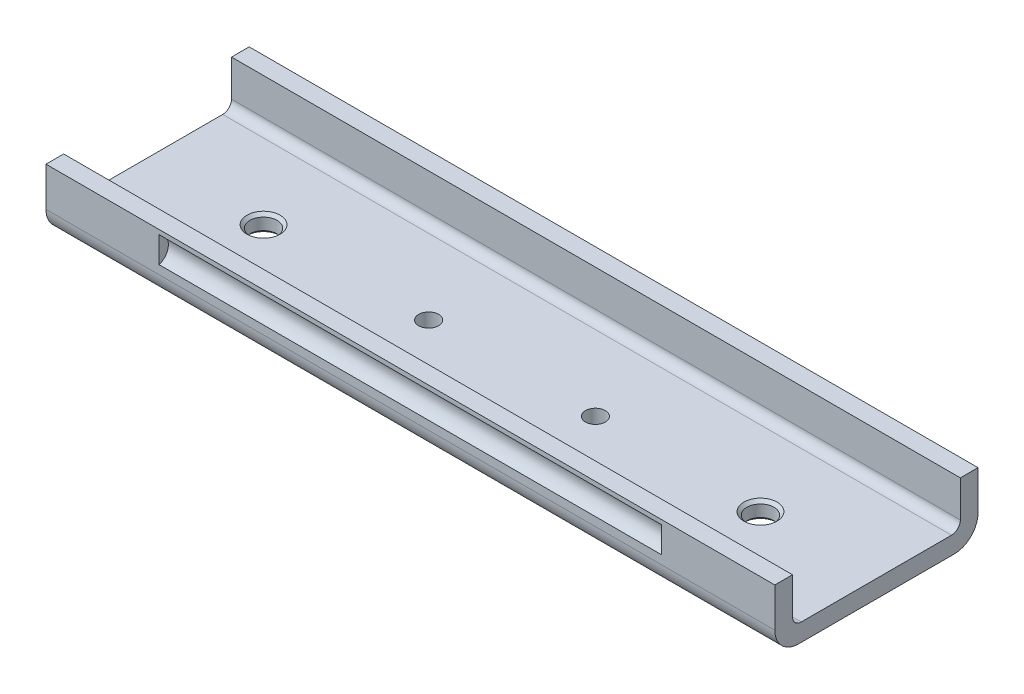
ISO-10303-21;
HEADER;
FILE_DESCRIPTION(('STEP AP214'),'2;1');
FILE_NAME('part.step','',(''),(''),'','','');
FILE_SCHEMA(('AUTOMOTIVE_DESIGN { 1 0 10303 214 1 1 1 1 }'));
ENDSEC;
DATA;
#1=APPLICATION_CONTEXT('core data for automotive mechanical design processes');
#2=APPLICATION_PROTOCOL_DEFINITION('international standard','automotive_design',2000,#1);
#3=PRODUCT_CONTEXT('',#1,'mechanical');
#4=PRODUCT('Part','Part','',(#3));
#5=PRODUCT_RELATED_PRODUCT_CATEGORY('part','',(#4));
#6=PRODUCT_DEFINITION_FORMATION('','',#4);
#7=PRODUCT_DEFINITION_CONTEXT('part definition',#1,'design');
#8=PRODUCT_DEFINITION('design','',#6,#7);
#9=PRODUCT_DEFINITION_SHAPE('','',#8);
#10=(LENGTH_UNIT() NAMED_UNIT(*) SI_UNIT(.MILLI.,.METRE.));
#11=(NAMED_UNIT(*) PLANE_ANGLE_UNIT() SI_UNIT($,.RADIAN.));
#12=(NAMED_UNIT(*) SI_UNIT($,.STERADIAN.) SOLID_ANGLE_UNIT());
#13=UNCERTAINTY_MEASURE_WITH_UNIT(LENGTH_MEASURE(1.E-05),#10,'distance_accuracy_value','');
#14=(GEOMETRIC_REPRESENTATION_CONTEXT(3) GLOBAL_UNCERTAINTY_ASSIGNED_CONTEXT((#13)) GLOBAL_UNIT_ASSIGNED_CONTEXT((#10,
#11,#12)) REPRESENTATION_CONTEXT('',''));
#15=CARTESIAN_POINT('',(0.,0.,0.));
#16=DIRECTION('',(0.,0.,1.));
#17=DIRECTION('',(1.,0.,0.));
#18=AXIS2_PLACEMENT_3D('',#15,#16,#17);
#19=CARTESIAN_POINT('',(10.25,4.11666666666667,-9.61666666666667));
#20=DIRECTION('',(1.,0.,0.));
#21=DIRECTION('',(0.,0.,-1.));
#22=AXIS2_PLACEMENT_3D('',#19,#20,#21);
#23=PLANE('',#22);
#24=DIRECTION('',(0.,1.,0.));
#25=VECTOR('',#24,1.);
#26=CARTESIAN_POINT('',(10.25,2.15,-9.2));
#27=LINE('',#26,#25);
#28=CARTESIAN_POINT('',(10.25,2.93815536468909,-9.2));
#29=VERTEX_POINT('',#28);
#30=CARTESIAN_POINT('',(10.25,5.29517796864425,-9.2));
#31=VERTEX_POINT('',#30);
#32=EDGE_CURVE('E118',#29,#31,#27,.T.);
#33=ORIENTED_EDGE('',*,*,#32,.T.);
#34=CARTESIAN_POINT('',(10.25,4.11666666666667,-9.61666666666667));
#35=DIRECTION('',(1.,0.,0.));
#36=DIRECTION('',(0.,0.,-1.));
#37=AXIS2_PLACEMENT_3D('',#34,#35,#36);
#38=CIRCLE('',#37,1.25);
#39=EDGE_CURVE('E19',#31,#29,#38,.T.);
#40=ORIENTED_EDGE('',*,*,#39,.T.);
#41=EDGE_LOOP('',(#33,#40));
#42=FACE_BOUND('',#41,.T.);
#43=ADVANCED_FACE('F16',(#42),#23,.T.);
#44=CARTESIAN_POINT('',(55.75,4.11666666666667,-9.61666666666667));
#45=DIRECTION('',(1.,0.,0.));
#46=DIRECTION('',(0.,0.,-1.));
#47=AXIS2_PLACEMENT_3D('',#44,#45,#46);
#48=PLANE('',#47);
#49=DIRECTION('',(0.,1.,0.));
#50=VECTOR('',#49,1.);
#51=CARTESIAN_POINT('',(55.75,2.15,-9.2));
#52=LINE('',#51,#50);
#53=CARTESIAN_POINT('',(55.75,5.29517796864425,-9.2));
#54=VERTEX_POINT('',#53);
#55=CARTESIAN_POINT('',(55.75,2.93815536468909,-9.2));
#56=VERTEX_POINT('',#55);
#57=EDGE_CURVE('E130',#54,#56,#52,.F.);
#58=ORIENTED_EDGE('',*,*,#57,.T.);
#59=CARTESIAN_POINT('',(55.75,4.11666666666667,-9.61666666666667));
#60=DIRECTION('',(1.,0.,0.));
#61=DIRECTION('',(0.,0.,-1.));
#62=AXIS2_PLACEMENT_3D('',#59,#60,#61);
#63=CIRCLE('',#62,1.25);
#64=EDGE_CURVE('E127',#56,#54,#63,.F.);
#65=ORIENTED_EDGE('',*,*,#64,.T.);
#66=EDGE_LOOP('',(#58,#65));
#67=FACE_BOUND('',#66,.T.);
#68=ADVANCED_FACE('F462',(#67),#48,.F.);
#69=CARTESIAN_POINT('',(55.75,4.11666666666667,-9.61666666666667));
#70=DIRECTION('',(1.,0.,0.));
#71=DIRECTION('',(0.,0.,-1.));
#72=AXIS2_PLACEMENT_3D('',#69,#70,#71);
#73=CYLINDRICAL_SURFACE('',#72,1.25);
#74=ORIENTED_EDGE('',*,*,#64,.F.);
#75=DIRECTION('',(1.,0.,0.));
#76=VECTOR('',#75,1.);
#77=CARTESIAN_POINT('',(66.,2.93815536468909,-9.2));
#78=LINE('',#77,#76);
#79=EDGE_CURVE('E121',#56,#29,#78,.F.);
#80=ORIENTED_EDGE('',*,*,#79,.T.);
#81=ORIENTED_EDGE('',*,*,#39,.F.);
#82=DIRECTION('',(1.,0.,0.));
#83=VECTOR('',#82,1.);
#84=CARTESIAN_POINT('',(66.,5.29517796864425,-9.2));
#85=LINE('',#84,#83);
#86=EDGE_CURVE('E123',#31,#54,#85,.T.);
#87=ORIENTED_EDGE('',*,*,#86,.T.);
#88=EDGE_LOOP('',(#74,#80,#81,#87));
#89=FACE_BOUND('',#88,.T.);
#90=ADVANCED_FACE('F128',(#89),#73,.F.);
#91=CARTESIAN_POINT('',(66.,5.7,-9.2));
#92=DIRECTION('',(0.,-1.,0.));
#93=DIRECTION('',(0.,0.,-1.));
#94=AXIS2_PLACEMENT_3D('',#91,#92,#93);
#95=PLANE('',#94);
#96=DIRECTION('',(-1.,0.,0.));
#97=VECTOR('',#96,1.);
#98=CARTESIAN_POINT('',(66.,5.7,-7.6));
#99=LINE('',#98,#97);
#100=CARTESIAN_POINT('',(0.,5.7,-7.6));
#101=VERTEX_POINT('',#100);
#102=CARTESIAN_POINT('',(66.,5.7,-7.6));
#103=VERTEX_POINT('',#102);
#104=EDGE_CURVE('E133',#101,#103,#99,.F.);
#105=ORIENTED_EDGE('',*,*,#104,.T.);
#106=DIRECTION('',(0.,0.,-1.));
#107=VECTOR('',#106,1.);
#108=CARTESIAN_POINT('',(66.,5.7,-9.2));
#109=LINE('',#108,#107);
#110=CARTESIAN_POINT('',(66.,5.7,-9.2));
#111=VERTEX_POINT('',#110);
#112=EDGE_CURVE('E194',#111,#103,#109,.F.);
#113=ORIENTED_EDGE('',*,*,#112,.F.);
#114=DIRECTION('',(1.,0.,0.));
#115=VECTOR('',#114,1.);
#116=CARTESIAN_POINT('',(66.,5.7,-9.2));
#117=LINE('',#116,#115);
#118=CARTESIAN_POINT('',(0.,5.7,-9.2));
#119=VERTEX_POINT('',#118);
#120=EDGE_CURVE('E129',#111,#119,#117,.F.);
#121=ORIENTED_EDGE('',*,*,#120,.T.);
#122=DIRECTION('',(0.,0.,-1.));
#123=VECTOR('',#122,1.);
#124=CARTESIAN_POINT('',(0.,5.7,-9.2));
#125=LINE('',#124,#123);
#126=EDGE_CURVE('E193',#101,#119,#125,.T.);
#127=ORIENTED_EDGE('',*,*,#126,.F.);
#128=EDGE_LOOP('',(#105,#113,#121,#127));
#129=FACE_BOUND('',#128,.T.);
#130=ADVANCED_FACE('F344',(#129),#95,.F.);
#131=CARTESIAN_POINT('',(55.5,1.59999999988258,0.));
#132=DIRECTION('',(0.,1.,0.));
#133=DIRECTION('',(0.,0.,1.));
#134=AXIS2_PLACEMENT_3D('',#131,#132,#133);
#135=CONICAL_SURFACE('',#134,1.49999999985084,0.785398163502519);
#136=CARTESIAN_POINT('',(55.5,1.59999999993943,0.));
#137=DIRECTION('',(0.,1.,0.));
#138=DIRECTION('',(0.,0.,1.));
#139=AXIS2_PLACEMENT_3D('',#136,#137,#138);
#140=CIRCLE('',#139,1.49999999990769);
#141=CARTESIAN_POINT('',(55.5,1.59999999993943,1.49999999990769));
#142=VERTEX_POINT('',#141);
#143=EDGE_CURVE('E176',#142,#142,#140,.T.);
#144=ORIENTED_EDGE('',*,*,#143,.T.);
#145=EDGE_LOOP('',(#144));
#146=FACE_BOUND('',#145,.T.);
#147=CARTESIAN_POINT('',(55.5,1.3295,0.));
#148=DIRECTION('',(0.,1.,0.));
#149=DIRECTION('',(0.,0.,1.));
#150=AXIS2_PLACEMENT_3D('',#147,#148,#149);
#151=CIRCLE('',#150,1.2295);
#152=CARTESIAN_POINT('',(55.5,1.3295,1.2295));
#153=VERTEX_POINT('',#152);
#154=EDGE_CURVE('E232',#153,#153,#151,.F.);
#155=ORIENTED_EDGE('',*,*,#154,.T.);
#156=EDGE_LOOP('',(#155));
#157=FACE_BOUND('',#156,.T.);
#158=ADVANCED_FACE('F445',(#146,#157),#135,.F.);
#159=CARTESIAN_POINT('',(10.5,1.59999999988258,0.));
#160=DIRECTION('',(0.,1.,0.));
#161=DIRECTION('',(0.,0.,1.));
#162=AXIS2_PLACEMENT_3D('',#159,#160,#161);
#163=CONICAL_SURFACE('',#162,1.49999999985084,0.785398163502519);
#164=CARTESIAN_POINT('',(10.5,1.59999999993943,0.));
#165=DIRECTION('',(0.,1.,0.));
#166=DIRECTION('',(0.,0.,1.));
#167=AXIS2_PLACEMENT_3D('',#164,#165,#166);
#168=CIRCLE('',#167,1.49999999990769);
#169=CARTESIAN_POINT('',(10.5,1.59999999993943,1.49999999990769));
#170=VERTEX_POINT('',#169);
#171=EDGE_CURVE('E172',#170,#170,#168,.T.);
#172=ORIENTED_EDGE('',*,*,#171,.T.);
#173=EDGE_LOOP('',(#172));
#174=FACE_BOUND('',#173,.T.);
#175=CARTESIAN_POINT('',(10.5,1.3295,0.));
#176=DIRECTION('',(0.,1.,0.));
#177=DIRECTION('',(0.,0.,1.));
#178=AXIS2_PLACEMENT_3D('',#175,#176,#177);
#179=CIRCLE('',#178,1.2295);
#180=CARTESIAN_POINT('',(10.5,1.3295,1.2295));
#181=VERTEX_POINT('',#180);
#182=EDGE_CURVE('E125',#181,#181,#179,.F.);
#183=ORIENTED_EDGE('',*,*,#182,.T.);
#184=EDGE_LOOP('',(#183));
#185=FACE_BOUND('',#184,.T.);
#186=ADVANCED_FACE('F442',(#174,#185),#163,.F.);
#187=CARTESIAN_POINT('',(66.,2.4,-6.8));
#188=DIRECTION('',(1.,0.,0.));
#189=DIRECTION('',(0.,0.,-1.));
#190=AXIS2_PLACEMENT_3D('',#187,#188,#189);
#191=CYLINDRICAL_SURFACE('',#190,0.800000000000002);
#192=DIRECTION('',(1.,0.,0.));
#193=VECTOR('',#192,1.);
#194=CARTESIAN_POINT('',(66.,1.6,-6.8));
#195=LINE('',#194,#193);
#196=CARTESIAN_POINT('',(0.,1.6,-6.8));
#197=VERTEX_POINT('',#196);
#198=CARTESIAN_POINT('',(66.,1.6,-6.8));
#199=VERTEX_POINT('',#198);
#200=EDGE_CURVE('E175',#197,#199,#195,.T.);
#201=ORIENTED_EDGE('',*,*,#200,.T.);
#202=CARTESIAN_POINT('',(66.,2.4,-6.8));
#203=DIRECTION('',(1.,0.,0.));
#204=DIRECTION('',(0.,0.,-1.));
#205=AXIS2_PLACEMENT_3D('',#202,#203,#204);
#206=CIRCLE('',#205,0.800000000000002);
#207=CARTESIAN_POINT('',(66.,2.4,-7.6));
#208=VERTEX_POINT('',#207);
#209=EDGE_CURVE('E192',#208,#199,#206,.F.);
#210=ORIENTED_EDGE('',*,*,#209,.F.);
#211=DIRECTION('',(-1.,0.,0.));
#212=VECTOR('',#211,1.);
#213=CARTESIAN_POINT('',(66.,2.4,-7.6));
#214=LINE('',#213,#212);
#215=CARTESIAN_POINT('',(0.,2.4,-7.6));
#216=VERTEX_POINT('',#215);
#217=EDGE_CURVE('E179',#208,#216,#214,.T.);
#218=ORIENTED_EDGE('',*,*,#217,.T.);
#219=CARTESIAN_POINT('',(0.,2.4,-6.8));
#220=DIRECTION('',(1.,0.,0.));
#221=DIRECTION('',(0.,0.,-1.));
#222=AXIS2_PLACEMENT_3D('',#219,#220,#221);
#223=CIRCLE('',#222,0.800000000000002);
#224=EDGE_CURVE('E190',#197,#216,#223,.T.);
#225=ORIENTED_EDGE('',*,*,#224,.F.);
#226=EDGE_LOOP('',(#201,#210,#218,#225));
#227=FACE_BOUND('',#226,.T.);
#228=ADVANCED_FACE('F444',(#227),#191,.F.);
#229=CARTESIAN_POINT('',(66.,2.4,6.8));
#230=DIRECTION('',(1.,0.,0.));
#231=DIRECTION('',(0.,0.,-1.));
#232=AXIS2_PLACEMENT_3D('',#229,#230,#231);
#233=CYLINDRICAL_SURFACE('',#232,0.800000000000003);
#234=DIRECTION('',(1.,0.,0.));
#235=VECTOR('',#234,1.);
#236=CARTESIAN_POINT('',(66.,2.4,7.6));
#237=LINE('',#236,#235);
#238=CARTESIAN_POINT('',(0.,2.4,7.6));
#239=VERTEX_POINT('',#238);
#240=CARTESIAN_POINT('',(66.,2.4,7.6));
#241=VERTEX_POINT('',#240);
#242=EDGE_CURVE('E256',#239,#241,#237,.T.);
#243=ORIENTED_EDGE('',*,*,#242,.T.);
#244=CARTESIAN_POINT('',(66.,2.4,6.8));
#245=DIRECTION('',(1.,0.,0.));
#246=DIRECTION('',(0.,0.,-1.));
#247=AXIS2_PLACEMENT_3D('',#244,#245,#246);
#248=CIRCLE('',#247,0.800000000000003);
#249=CARTESIAN_POINT('',(66.,1.6,6.8));
#250=VERTEX_POINT('',#249);
#251=EDGE_CURVE('E188',#250,#241,#248,.F.);
#252=ORIENTED_EDGE('',*,*,#251,.F.);
#253=DIRECTION('',(1.,0.,0.));
#254=VECTOR('',#253,1.);
#255=CARTESIAN_POINT('',(66.,1.6,6.8));
#256=LINE('',#255,#254);
#257=CARTESIAN_POINT('',(0.,1.6,6.8));
#258=VERTEX_POINT('',#257);
#259=EDGE_CURVE('E253',#250,#258,#256,.F.);
#260=ORIENTED_EDGE('',*,*,#259,.T.);
#261=CARTESIAN_POINT('',(0.,2.4,6.8));
#262=DIRECTION('',(1.,0.,0.));
#263=DIRECTION('',(0.,0.,-1.));
#264=AXIS2_PLACEMENT_3D('',#261,#262,#263);
#265=CIRCLE('',#264,0.800000000000003);
#266=EDGE_CURVE('E186',#239,#258,#265,.T.);
#267=ORIENTED_EDGE('',*,*,#266,.F.);
#268=EDGE_LOOP('',(#243,#252,#260,#267));
#269=FACE_BOUND('',#268,.T.);
#270=ADVANCED_FACE('F452',(#269),#233,.F.);
#271=CARTESIAN_POINT('',(10.25,4.11666666666668,9.61666666666667));
#272=DIRECTION('',(1.,0.,0.));
#273=DIRECTION('',(0.,0.,-1.));
#274=AXIS2_PLACEMENT_3D('',#271,#272,#273);
#275=PLANE('',#274);
#276=DIRECTION('',(0.,1.,0.));
#277=VECTOR('',#276,1.);
#278=CARTESIAN_POINT('',(10.25,5.7,9.2));
#279=LINE('',#278,#277);
#280=CARTESIAN_POINT('',(10.25,5.29517796864426,9.2));
#281=VERTEX_POINT('',#280);
#282=CARTESIAN_POINT('',(10.25,2.9381553646891,9.2));
#283=VERTEX_POINT('',#282);
#284=EDGE_CURVE('E210',#281,#283,#279,.F.);
#285=ORIENTED_EDGE('',*,*,#284,.T.);
#286=CARTESIAN_POINT('',(10.25,4.11666666666668,9.61666666666667));
#287=DIRECTION('',(1.,0.,0.));
#288=DIRECTION('',(0.,0.,-1.));
#289=AXIS2_PLACEMENT_3D('',#286,#287,#288);
#290=CIRCLE('',#289,1.25);
#291=EDGE_CURVE('E183',#283,#281,#290,.T.);
#292=ORIENTED_EDGE('',*,*,#291,.T.);
#293=EDGE_LOOP('',(#285,#292));
#294=FACE_BOUND('',#293,.T.);
#295=ADVANCED_FACE('F515',(#294),#275,.T.);
#296=CARTESIAN_POINT('',(55.75,4.11666666666668,9.61666666666667));
#297=DIRECTION('',(1.,0.,0.));
#298=DIRECTION('',(0.,0.,-1.));
#299=AXIS2_PLACEMENT_3D('',#296,#297,#298);
#300=PLANE('',#299);
#301=DIRECTION('',(0.,1.,0.));
#302=VECTOR('',#301,1.);
#303=CARTESIAN_POINT('',(55.75,5.7,9.2));
#304=LINE('',#303,#302);
#305=CARTESIAN_POINT('',(55.75,2.9381553646891,9.2));
#306=VERTEX_POINT('',#305);
#307=CARTESIAN_POINT('',(55.75,5.29517796864426,9.2));
#308=VERTEX_POINT('',#307);
#309=EDGE_CURVE('E218',#306,#308,#304,.T.);
#310=ORIENTED_EDGE('',*,*,#309,.T.);
#311=CARTESIAN_POINT('',(55.75,4.11666666666668,9.61666666666667));
#312=DIRECTION('',(1.,0.,0.));
#313=DIRECTION('',(0.,0.,-1.));
#314=AXIS2_PLACEMENT_3D('',#311,#312,#313);
#315=CIRCLE('',#314,1.25);
#316=EDGE_CURVE('E180',#308,#306,#315,.F.);
#317=ORIENTED_EDGE('',*,*,#316,.T.);
#318=EDGE_LOOP('',(#310,#317));
#319=FACE_BOUND('',#318,.T.);
#320=ADVANCED_FACE('F375',(#319),#300,.F.);
#321=CARTESIAN_POINT('',(55.75,4.11666666666668,9.61666666666667));
#322=DIRECTION('',(1.,0.,0.));
#323=DIRECTION('',(0.,0.,-1.));
#324=AXIS2_PLACEMENT_3D('',#321,#322,#323);
#325=CYLINDRICAL_SURFACE('',#324,1.25);
#326=ORIENTED_EDGE('',*,*,#316,.F.);
#327=DIRECTION('',(-1.,0.,0.));
#328=VECTOR('',#327,1.);
#329=CARTESIAN_POINT('',(66.,5.29517796864426,9.2));
#330=LINE('',#329,#328);
#331=EDGE_CURVE('E215',#308,#281,#330,.T.);
#332=ORIENTED_EDGE('',*,*,#331,.T.);
#333=ORIENTED_EDGE('',*,*,#291,.F.);
#334=DIRECTION('',(-1.,0.,0.));
#335=VECTOR('',#334,1.);
#336=CARTESIAN_POINT('',(66.,2.9381553646891,9.2));
#337=LINE('',#336,#335);
#338=EDGE_CURVE('E213',#283,#306,#337,.F.);
#339=ORIENTED_EDGE('',*,*,#338,.T.);
#340=EDGE_LOOP('',(#326,#332,#333,#339));
#341=FACE_BOUND('',#340,.T.);
#342=ADVANCED_FACE('F365',(#341),#325,.F.);
#343=CARTESIAN_POINT('',(66.,5.7,7.6));
#344=DIRECTION('',(0.,-1.,0.));
#345=DIRECTION('',(0.,0.,-1.));
#346=AXIS2_PLACEMENT_3D('',#343,#344,#345);
#347=PLANE('',#346);
#348=DIRECTION('',(-1.,0.,0.));
#349=VECTOR('',#348,1.);
#350=CARTESIAN_POINT('',(66.,5.7,9.2));
#351=LINE('',#350,#349);
#352=CARTESIAN_POINT('',(0.,5.7,9.2));
#353=VERTEX_POINT('',#352);
#354=CARTESIAN_POINT('',(66.,5.7,9.2));
#355=VERTEX_POINT('',#354);
#356=EDGE_CURVE('E171',#353,#355,#351,.F.);
#357=ORIENTED_EDGE('',*,*,#356,.T.);
#358=DIRECTION('',(0.,0.,-1.));
#359=VECTOR('',#358,1.);
#360=CARTESIAN_POINT('',(66.,5.7,7.6));
#361=LINE('',#360,#359);
#362=CARTESIAN_POINT('',(66.,5.7,7.6));
#363=VERTEX_POINT('',#362);
#364=EDGE_CURVE('E182',#363,#355,#361,.F.);
#365=ORIENTED_EDGE('',*,*,#364,.F.);
#366=DIRECTION('',(1.,0.,0.));
#367=VECTOR('',#366,1.);
#368=CARTESIAN_POINT('',(66.,5.7,7.6));
#369=LINE('',#368,#367);
#370=CARTESIAN_POINT('',(0.,5.7,7.6));
#371=VERTEX_POINT('',#370);
#372=EDGE_CURVE('E214',#363,#371,#369,.F.);
#373=ORIENTED_EDGE('',*,*,#372,.T.);
#374=DIRECTION('',(0.,0.,-1.));
#375=VECTOR('',#374,1.);
#376=CARTESIAN_POINT('',(0.,5.7,7.6));
#377=LINE('',#376,#375);
#378=EDGE_CURVE('E227',#353,#371,#377,.T.);
#379=ORIENTED_EDGE('',*,*,#378,.F.);
#380=EDGE_LOOP('',(#357,#365,#373,#379));
#381=FACE_BOUND('',#380,.T.);
#382=ADVANCED_FACE('F362',(#381),#347,.F.);
#383=CARTESIAN_POINT('',(55.5,0.,0.));
#384=DIRECTION('',(0.,1.,0.));
#385=DIRECTION('',(0.,0.,1.));
#386=AXIS2_PLACEMENT_3D('',#383,#384,#385);
#387=CYLINDRICAL_SURFACE('',#386,1.2295);
#388=ORIENTED_EDGE('',*,*,#154,.F.);
#389=EDGE_LOOP('',(#388));
#390=FACE_BOUND('',#389,.T.);
#391=CARTESIAN_POINT('',(55.5,0.270499999942331,0.));
#392=DIRECTION('',(0.,-1.,0.));
#393=DIRECTION('',(0.,0.,-1.));
#394=AXIS2_PLACEMENT_3D('',#391,#392,#393);
#395=CIRCLE('',#394,1.2295000000222);
#396=CARTESIAN_POINT('',(55.5,0.270499999942331,-1.2295000000222));
#397=VERTEX_POINT('',#396);
#398=EDGE_CURVE('E167',#397,#397,#395,.T.);
#399=ORIENTED_EDGE('',*,*,#398,.T.);
#400=EDGE_LOOP('',(#399));
#401=FACE_BOUND('',#400,.T.);
#402=ADVANCED_FACE('F364',(#390,#401),#387,.F.);
#403=CARTESIAN_POINT('',(10.5,0.,0.));
#404=DIRECTION('',(0.,1.,0.));
#405=DIRECTION('',(0.,0.,1.));
#406=AXIS2_PLACEMENT_3D('',#403,#404,#405);
#407=CYLINDRICAL_SURFACE('',#406,1.2295);
#408=ORIENTED_EDGE('',*,*,#182,.F.);
#409=EDGE_LOOP('',(#408));
#410=FACE_BOUND('',#409,.T.);
#411=CARTESIAN_POINT('',(10.5,0.270499999942331,0.));
#412=DIRECTION('',(0.,-1.,0.));
#413=DIRECTION('',(0.,0.,-1.));
#414=AXIS2_PLACEMENT_3D('',#411,#412,#413);
#415=CIRCLE('',#414,1.2295000000222);
#416=CARTESIAN_POINT('',(10.5,0.270499999942331,-1.2295000000222));
#417=VERTEX_POINT('',#416);
#418=EDGE_CURVE('E243',#417,#417,#415,.T.);
#419=ORIENTED_EDGE('',*,*,#418,.T.);
#420=EDGE_LOOP('',(#419));
#421=FACE_BOUND('',#420,.T.);
#422=ADVANCED_FACE('F372',(#410,#421),#407,.F.);
#423=CARTESIAN_POINT('',(66.,2.15,-9.2));
#424=DIRECTION('',(0.,0.,1.));
#425=DIRECTION('',(1.,0.,0.));
#426=AXIS2_PLACEMENT_3D('',#423,#424,#425);
#427=PLANE('',#426);
#428=ORIENTED_EDGE('',*,*,#120,.F.);
#429=DIRECTION('',(0.,1.,0.));
#430=VECTOR('',#429,1.);
#431=CARTESIAN_POINT('',(66.,2.15,-9.2));
#432=LINE('',#431,#430);
#433=CARTESIAN_POINT('',(66.,2.15,-9.2));
#434=VERTEX_POINT('',#433);
#435=EDGE_CURVE('E162',#434,#111,#432,.T.);
#436=ORIENTED_EDGE('',*,*,#435,.F.);
#437=DIRECTION('',(1.,0.,0.));
#438=VECTOR('',#437,1.);
#439=CARTESIAN_POINT('',(66.,2.15,-9.2));
#440=LINE('',#439,#438);
#441=CARTESIAN_POINT('',(0.,2.15,-9.2));
#442=VERTEX_POINT('',#441);
#443=EDGE_CURVE('E159',#442,#434,#440,.T.);
#444=ORIENTED_EDGE('',*,*,#443,.F.);
#445=DIRECTION('',(0.,1.,0.));
#446=VECTOR('',#445,1.);
#447=CARTESIAN_POINT('',(0.,2.15,-9.2));
#448=LINE('',#447,#446);
#449=EDGE_CURVE('E153',#442,#119,#448,.T.);
#450=ORIENTED_EDGE('',*,*,#449,.T.);
#451=EDGE_LOOP('',(#428,#436,#444,#450));
#452=FACE_BOUND('',#451,.T.);
#453=ORIENTED_EDGE('',*,*,#57,.F.);
#454=ORIENTED_EDGE('',*,*,#86,.F.);
#455=ORIENTED_EDGE('',*,*,#32,.F.);
#456=ORIENTED_EDGE('',*,*,#79,.F.);
#457=EDGE_LOOP('',(#453,#454,#455,#456));
#458=FACE_BOUND('',#457,.T.);
#459=ADVANCED_FACE('F120',(#452,#458),#427,.F.);
#460=CARTESIAN_POINT('',(66.,5.7,-7.6));
#461=DIRECTION('',(0.,0.,-1.));
#462=DIRECTION('',(-1.,0.,0.));
#463=AXIS2_PLACEMENT_3D('',#460,#461,#462);
#464=PLANE('',#463);
#465=ORIENTED_EDGE('',*,*,#217,.F.);
#466=DIRECTION('',(0.,1.,0.));
#467=VECTOR('',#466,1.);
#468=CARTESIAN_POINT('',(66.,2.15,-7.6));
#469=LINE('',#468,#467);
#470=EDGE_CURVE('E283',#103,#208,#469,.F.);
#471=ORIENTED_EDGE('',*,*,#470,.F.);
#472=ORIENTED_EDGE('',*,*,#104,.F.);
#473=DIRECTION('',(0.,1.,0.));
#474=VECTOR('',#473,1.);
#475=CARTESIAN_POINT('',(0.,2.15,-7.6));
#476=LINE('',#475,#474);
#477=EDGE_CURVE('E305',#101,#216,#476,.F.);
#478=ORIENTED_EDGE('',*,*,#477,.T.);
#479=EDGE_LOOP('',(#465,#471,#472,#478));
#480=FACE_BOUND('',#479,.T.);
#481=ADVANCED_FACE('F416',(#480),#464,.F.);
#482=CARTESIAN_POINT('',(66.,1.6,-6.8));
#483=DIRECTION('',(0.,-1.,0.));
#484=DIRECTION('',(0.,0.,-1.));
#485=AXIS2_PLACEMENT_3D('',#482,#483,#484);
#486=PLANE('',#485);
#487=ORIENTED_EDGE('',*,*,#259,.F.);
#488=DIRECTION('',(0.,0.,-1.));
#489=VECTOR('',#488,1.);
#490=CARTESIAN_POINT('',(66.,1.6,7.05));
#491=LINE('',#490,#489);
#492=EDGE_CURVE('E287',#199,#250,#491,.F.);
#493=ORIENTED_EDGE('',*,*,#492,.F.);
#494=ORIENTED_EDGE('',*,*,#200,.F.);
#495=DIRECTION('',(0.,0.,-1.));
#496=VECTOR('',#495,1.);
#497=CARTESIAN_POINT('',(0.,1.6,7.05));
#498=LINE('',#497,#496);
#499=EDGE_CURVE('E310',#197,#258,#498,.F.);
#500=ORIENTED_EDGE('',*,*,#499,.T.);
#501=EDGE_LOOP('',(#487,#493,#494,#500));
#502=FACE_BOUND('',#501,.T.);
#503=ORIENTED_EDGE('',*,*,#171,.F.);
#504=EDGE_LOOP('',(#503));
#505=FACE_BOUND('',#504,.T.);
#506=ORIENTED_EDGE('',*,*,#143,.F.);
#507=EDGE_LOOP('',(#506));
#508=FACE_BOUND('',#507,.T.);
#509=CARTESIAN_POINT('',(25.45,1.6,0.));
#510=DIRECTION('',(0.,1.,0.));
#511=DIRECTION('',(0.,0.,1.));
#512=AXIS2_PLACEMENT_3D('',#509,#510,#511);
#513=CIRCLE('',#512,0.9);
#514=CARTESIAN_POINT('',(25.45,1.6,0.9));
#515=VERTEX_POINT('',#514);
#516=EDGE_CURVE('E164',#515,#515,#513,.F.);
#517=ORIENTED_EDGE('',*,*,#516,.T.);
#518=EDGE_LOOP('',(#517));
#519=FACE_BOUND('',#518,.T.);
#520=CARTESIAN_POINT('',(40.55,1.6,0.));
#521=DIRECTION('',(0.,1.,0.));
#522=DIRECTION('',(0.,0.,1.));
#523=AXIS2_PLACEMENT_3D('',#520,#521,#522);
#524=CIRCLE('',#523,0.9);
#525=CARTESIAN_POINT('',(40.55,1.6,0.9));
#526=VERTEX_POINT('',#525);
#527=EDGE_CURVE('E168',#526,#526,#524,.F.);
#528=ORIENTED_EDGE('',*,*,#527,.T.);
#529=EDGE_LOOP('',(#528));
#530=FACE_BOUND('',#529,.T.);
#531=ADVANCED_FACE('F412',(#502,#505,#508,#519,#530),#486,.F.);
#532=CARTESIAN_POINT('',(66.,2.4,7.6));
#533=DIRECTION('',(0.,0.,1.));
#534=DIRECTION('',(1.,0.,0.));
#535=AXIS2_PLACEMENT_3D('',#532,#533,#534);
#536=PLANE('',#535);
#537=ORIENTED_EDGE('',*,*,#372,.F.);
#538=DIRECTION('',(0.,1.,0.));
#539=VECTOR('',#538,1.);
#540=CARTESIAN_POINT('',(66.,2.15,7.6));
#541=LINE('',#540,#539);
#542=EDGE_CURVE('E245',#241,#363,#541,.T.);
#543=ORIENTED_EDGE('',*,*,#542,.F.);
#544=ORIENTED_EDGE('',*,*,#242,.F.);
#545=DIRECTION('',(0.,1.,0.));
#546=VECTOR('',#545,1.);
#547=CARTESIAN_POINT('',(0.,2.15,7.6));
#548=LINE('',#547,#546);
#549=EDGE_CURVE('E313',#239,#371,#548,.T.);
#550=ORIENTED_EDGE('',*,*,#549,.T.);
#551=EDGE_LOOP('',(#537,#543,#544,#550));
#552=FACE_BOUND('',#551,.T.);
#553=ADVANCED_FACE('F409',(#552),#536,.F.);
#554=CARTESIAN_POINT('',(66.,5.7,9.2));
#555=DIRECTION('',(0.,0.,-1.));
#556=DIRECTION('',(-1.,0.,0.));
#557=AXIS2_PLACEMENT_3D('',#554,#555,#556);
#558=PLANE('',#557);
#559=DIRECTION('',(1.,0.,0.));
#560=VECTOR('',#559,1.);
#561=CARTESIAN_POINT('',(66.,2.15,9.2));
#562=LINE('',#561,#560);
#563=CARTESIAN_POINT('',(66.,2.15,9.2));
#564=VERTEX_POINT('',#563);
#565=CARTESIAN_POINT('',(0.,2.15,9.2));
#566=VERTEX_POINT('',#565);
#567=EDGE_CURVE('E241',#564,#566,#562,.F.);
#568=ORIENTED_EDGE('',*,*,#567,.F.);
#569=DIRECTION('',(0.,1.,0.));
#570=VECTOR('',#569,1.);
#571=CARTESIAN_POINT('',(66.,2.15,9.2));
#572=LINE('',#571,#570);
#573=EDGE_CURVE('E163',#355,#564,#572,.F.);
#574=ORIENTED_EDGE('',*,*,#573,.F.);
#575=ORIENTED_EDGE('',*,*,#356,.F.);
#576=DIRECTION('',(0.,1.,0.));
#577=VECTOR('',#576,1.);
#578=CARTESIAN_POINT('',(0.,2.15,9.2));
#579=LINE('',#578,#577);
#580=EDGE_CURVE('E151',#353,#566,#579,.F.);
#581=ORIENTED_EDGE('',*,*,#580,.T.);
#582=EDGE_LOOP('',(#568,#574,#575,#581));
#583=FACE_BOUND('',#582,.T.);
#584=ORIENTED_EDGE('',*,*,#309,.F.);
#585=ORIENTED_EDGE('',*,*,#338,.F.);
#586=ORIENTED_EDGE('',*,*,#284,.F.);
#587=ORIENTED_EDGE('',*,*,#331,.F.);
#588=EDGE_LOOP('',(#584,#585,#586,#587));
#589=FACE_BOUND('',#588,.T.);
#590=ADVANCED_FACE('F325',(#583,#589),#558,.F.);
#591=CARTESIAN_POINT('',(40.55,0.,0.));
#592=DIRECTION('',(0.,1.,0.));
#593=DIRECTION('',(0.,0.,1.));
#594=AXIS2_PLACEMENT_3D('',#591,#592,#593);
#595=CYLINDRICAL_SURFACE('',#594,0.9);
#596=ORIENTED_EDGE('',*,*,#527,.F.);
#597=EDGE_LOOP('',(#596));
#598=FACE_BOUND('',#597,.T.);
#599=CARTESIAN_POINT('',(40.55,0.,0.));
#600=DIRECTION('',(0.,1.,0.));
#601=DIRECTION('',(0.,0.,1.));
#602=AXIS2_PLACEMENT_3D('',#599,#600,#601);
#603=CIRCLE('',#602,0.9);
#604=CARTESIAN_POINT('',(40.55,0.,0.9));
#605=VERTEX_POINT('',#604);
#606=EDGE_CURVE('E148',#605,#605,#603,.F.);
#607=ORIENTED_EDGE('',*,*,#606,.T.);
#608=EDGE_LOOP('',(#607));
#609=FACE_BOUND('',#608,.T.);
#610=ADVANCED_FACE('F402',(#598,#609),#595,.F.);
#611=CARTESIAN_POINT('',(25.45,0.,0.));
#612=DIRECTION('',(0.,1.,0.));
#613=DIRECTION('',(0.,0.,1.));
#614=AXIS2_PLACEMENT_3D('',#611,#612,#613);
#615=CYLINDRICAL_SURFACE('',#614,0.9);
#616=ORIENTED_EDGE('',*,*,#516,.F.);
#617=EDGE_LOOP('',(#616));
#618=FACE_BOUND('',#617,.T.);
#619=CARTESIAN_POINT('',(25.45,0.,0.));
#620=DIRECTION('',(0.,1.,0.));
#621=DIRECTION('',(0.,0.,1.));
#622=AXIS2_PLACEMENT_3D('',#619,#620,#621);
#623=CIRCLE('',#622,0.9);
#624=CARTESIAN_POINT('',(25.45,0.,0.9));
#625=VERTEX_POINT('',#624);
#626=EDGE_CURVE('E145',#625,#625,#623,.F.);
#627=ORIENTED_EDGE('',*,*,#626,.T.);
#628=EDGE_LOOP('',(#627));
#629=FACE_BOUND('',#628,.T.);
#630=ADVANCED_FACE('F398',(#618,#629),#615,.F.);
#631=CARTESIAN_POINT('',(55.5,1.13686837721616E-10,0.));
#632=DIRECTION('',(0.,-1.,0.));
#633=DIRECTION('',(0.,0.,-1.));
#634=AXIS2_PLACEMENT_3D('',#631,#632,#633);
#635=CONICAL_SURFACE('',#634,1.49999999990769,0.785398163397448);
#636=ORIENTED_EDGE('',*,*,#398,.F.);
#637=EDGE_LOOP('',(#636));
#638=FACE_BOUND('',#637,.T.);
#639=CARTESIAN_POINT('',(55.5,5.6843418860808E-11,0.));
#640=DIRECTION('',(0.,-1.,0.));
#641=DIRECTION('',(0.,0.,-1.));
#642=AXIS2_PLACEMENT_3D('',#639,#640,#641);
#643=CIRCLE('',#642,1.49999999996453);
#644=CARTESIAN_POINT('',(55.5,5.6843418860808E-11,-1.49999999996453));
#645=VERTEX_POINT('',#644);
#646=EDGE_CURVE('E142',#645,#645,#643,.T.);
#647=ORIENTED_EDGE('',*,*,#646,.T.);
#648=EDGE_LOOP('',(#647));
#649=FACE_BOUND('',#648,.T.);
#650=ADVANCED_FACE('F394',(#638,#649),#635,.F.);
#651=CARTESIAN_POINT('',(10.5,1.13686837721616E-10,0.));
#652=DIRECTION('',(0.,-1.,0.));
#653=DIRECTION('',(0.,0.,-1.));
#654=AXIS2_PLACEMENT_3D('',#651,#652,#653);
#655=CONICAL_SURFACE('',#654,1.49999999990769,0.785398163397448);
#656=ORIENTED_EDGE('',*,*,#418,.F.);
#657=EDGE_LOOP('',(#656));
#658=FACE_BOUND('',#657,.T.);
#659=CARTESIAN_POINT('',(10.5,5.6843418860808E-11,0.));
#660=DIRECTION('',(0.,-1.,0.));
#661=DIRECTION('',(0.,0.,-1.));
#662=AXIS2_PLACEMENT_3D('',#659,#660,#661);
#663=CIRCLE('',#662,1.49999999996453);
#664=CARTESIAN_POINT('',(10.5,5.6843418860808E-11,-1.49999999996453));
#665=VERTEX_POINT('',#664);
#666=EDGE_CURVE('E138',#665,#665,#663,.T.);
#667=ORIENTED_EDGE('',*,*,#666,.T.);
#668=EDGE_LOOP('',(#667));
#669=FACE_BOUND('',#668,.T.);
#670=ADVANCED_FACE('F391',(#658,#669),#655,.F.);
#671=CARTESIAN_POINT('',(66.,2.15,7.05));
#672=DIRECTION('',(1.,0.,0.));
#673=DIRECTION('',(0.,0.,-1.));
#674=AXIS2_PLACEMENT_3D('',#671,#672,#673);
#675=CYLINDRICAL_SURFACE('',#674,2.15);
#676=CARTESIAN_POINT('',(66.,2.15,7.05));
#677=DIRECTION('',(1.,0.,0.));
#678=DIRECTION('',(0.,0.,-1.));
#679=AXIS2_PLACEMENT_3D('',#676,#677,#678);
#680=CIRCLE('',#679,2.15);
#681=CARTESIAN_POINT('',(66.,0.,7.05));
#682=VERTEX_POINT('',#681);
#683=EDGE_CURVE('E160',#564,#682,#680,.T.);
#684=ORIENTED_EDGE('',*,*,#683,.F.);
#685=ORIENTED_EDGE('',*,*,#567,.T.);
#686=CARTESIAN_POINT('',(0.,2.15,7.05));
#687=DIRECTION('',(1.,0.,0.));
#688=DIRECTION('',(0.,0.,-1.));
#689=AXIS2_PLACEMENT_3D('',#686,#687,#688);
#690=CIRCLE('',#689,2.15);
#691=CARTESIAN_POINT('',(0.,0.,7.05));
#692=VERTEX_POINT('',#691);
#693=EDGE_CURVE('E154',#566,#692,#690,.T.);
#694=ORIENTED_EDGE('',*,*,#693,.T.);
#695=DIRECTION('',(1.,0.,0.));
#696=VECTOR('',#695,1.);
#697=CARTESIAN_POINT('',(66.,0.,7.05));
#698=LINE('',#697,#696);
#699=EDGE_CURVE('E141',#692,#682,#698,.T.);
#700=ORIENTED_EDGE('',*,*,#699,.T.);
#701=EDGE_LOOP('',(#684,#685,#694,#700));
#702=FACE_BOUND('',#701,.T.);
#703=ADVANCED_FACE('F359',(#702),#675,.T.);
#704=CARTESIAN_POINT('',(66.,2.15,7.05));
#705=DIRECTION('',(1.,0.,0.));
#706=DIRECTION('',(0.,0.,-1.));
#707=AXIS2_PLACEMENT_3D('',#704,#705,#706);
#708=PLANE('',#707);
#709=ORIENTED_EDGE('',*,*,#542,.T.);
#710=ORIENTED_EDGE('',*,*,#364,.T.);
#711=ORIENTED_EDGE('',*,*,#573,.T.);
#712=ORIENTED_EDGE('',*,*,#683,.T.);
#713=DIRECTION('',(0.,0.,1.));
#714=VECTOR('',#713,1.);
#715=CARTESIAN_POINT('',(66.,0.,7.05));
#716=LINE('',#715,#714);
#717=CARTESIAN_POINT('',(66.,0.,-7.05));
#718=VERTEX_POINT('',#717);
#719=EDGE_CURVE('E294',#682,#718,#716,.F.);
#720=ORIENTED_EDGE('',*,*,#719,.T.);
#721=CARTESIAN_POINT('',(66.,2.15,-7.05));
#722=DIRECTION('',(1.,0.,0.));
#723=DIRECTION('',(0.,0.,-1.));
#724=AXIS2_PLACEMENT_3D('',#721,#722,#723);
#725=CIRCLE('',#724,2.15);
#726=EDGE_CURVE('E157',#434,#718,#725,.F.);
#727=ORIENTED_EDGE('',*,*,#726,.F.);
#728=ORIENTED_EDGE('',*,*,#435,.T.);
#729=ORIENTED_EDGE('',*,*,#112,.T.);
#730=ORIENTED_EDGE('',*,*,#470,.T.);
#731=ORIENTED_EDGE('',*,*,#209,.T.);
#732=ORIENTED_EDGE('',*,*,#492,.T.);
#733=ORIENTED_EDGE('',*,*,#251,.T.);
#734=EDGE_LOOP('',(#709,#710,#711,#712,#720,#727,#728,#729,#730,#731,#732,#733));
#735=FACE_BOUND('',#734,.T.);
#736=ADVANCED_FACE('F350',(#735),#708,.T.);
#737=CARTESIAN_POINT('',(66.,2.15,-7.05));
#738=DIRECTION('',(1.,0.,0.));
#739=DIRECTION('',(0.,0.,-1.));
#740=AXIS2_PLACEMENT_3D('',#737,#738,#739);
#741=CYLINDRICAL_SURFACE('',#740,2.15);
#742=ORIENTED_EDGE('',*,*,#726,.T.);
#743=DIRECTION('',(1.,0.,0.));
#744=VECTOR('',#743,1.);
#745=CARTESIAN_POINT('',(66.,0.,-7.05));
#746=LINE('',#745,#744);
#747=CARTESIAN_POINT('',(0.,0.,-7.05));
#748=VERTEX_POINT('',#747);
#749=EDGE_CURVE('E25',#718,#748,#746,.F.);
#750=ORIENTED_EDGE('',*,*,#749,.T.);
#751=CARTESIAN_POINT('',(0.,2.15,-7.05));
#752=DIRECTION('',(1.,0.,0.));
#753=DIRECTION('',(0.,0.,-1.));
#754=AXIS2_PLACEMENT_3D('',#751,#752,#753);
#755=CIRCLE('',#754,2.15);
#756=EDGE_CURVE('E33',#748,#442,#755,.T.);
#757=ORIENTED_EDGE('',*,*,#756,.T.);
#758=ORIENTED_EDGE('',*,*,#443,.T.);
#759=EDGE_LOOP('',(#742,#750,#757,#758));
#760=FACE_BOUND('',#759,.T.);
#761=ADVANCED_FACE('F354',(#760),#741,.T.);
#762=CARTESIAN_POINT('',(0.,2.15,7.05));
#763=DIRECTION('',(1.,0.,0.));
#764=DIRECTION('',(0.,0.,-1.));
#765=AXIS2_PLACEMENT_3D('',#762,#763,#764);
#766=PLANE('',#765);
#767=ORIENTED_EDGE('',*,*,#378,.T.);
#768=ORIENTED_EDGE('',*,*,#549,.F.);
#769=ORIENTED_EDGE('',*,*,#266,.T.);
#770=ORIENTED_EDGE('',*,*,#499,.F.);
#771=ORIENTED_EDGE('',*,*,#224,.T.);
#772=ORIENTED_EDGE('',*,*,#477,.F.);
#773=ORIENTED_EDGE('',*,*,#126,.T.);
#774=ORIENTED_EDGE('',*,*,#449,.F.);
#775=ORIENTED_EDGE('',*,*,#756,.F.);
#776=DIRECTION('',(0.,0.,1.));
#777=VECTOR('',#776,1.);
#778=CARTESIAN_POINT('',(0.,0.,7.05));
#779=LINE('',#778,#777);
#780=EDGE_CURVE('E11',#748,#692,#779,.T.);
#781=ORIENTED_EDGE('',*,*,#780,.T.);
#782=ORIENTED_EDGE('',*,*,#693,.F.);
#783=ORIENTED_EDGE('',*,*,#580,.F.);
#784=EDGE_LOOP('',(#767,#768,#769,#770,#771,#772,#773,#774,#775,#781,#782,#783));
#785=FACE_BOUND('',#784,.T.);
#786=ADVANCED_FACE('F330',(#785),#766,.F.);
#787=CARTESIAN_POINT('',(66.,0.,7.05));
#788=DIRECTION('',(0.,1.,0.));
#789=DIRECTION('',(0.,0.,1.));
#790=AXIS2_PLACEMENT_3D('',#787,#788,#789);
#791=PLANE('',#790);
#792=ORIENTED_EDGE('',*,*,#749,.F.);
#793=ORIENTED_EDGE('',*,*,#719,.F.);
#794=ORIENTED_EDGE('',*,*,#699,.F.);
#795=ORIENTED_EDGE('',*,*,#780,.F.);
#796=EDGE_LOOP('',(#792,#793,#794,#795));
#797=FACE_BOUND('',#796,.T.);
#798=ORIENTED_EDGE('',*,*,#666,.F.);
#799=EDGE_LOOP('',(#798));
#800=FACE_BOUND('',#799,.T.);
#801=ORIENTED_EDGE('',*,*,#646,.F.);
#802=EDGE_LOOP('',(#801));
#803=FACE_BOUND('',#802,.T.);
#804=ORIENTED_EDGE('',*,*,#626,.F.);
#805=EDGE_LOOP('',(#804));
#806=FACE_BOUND('',#805,.T.);
#807=ORIENTED_EDGE('',*,*,#606,.F.);
#808=EDGE_LOOP('',(#807));
#809=FACE_BOUND('',#808,.T.);
#810=ADVANCED_FACE('F356',(#797,#800,#803,#806,#809),#791,.F.);
#811=CLOSED_SHELL('',(#43,#68,#90,#130,#158,#186,#228,#270,#295,#320,#342,#382,#402,#422,#459,
#481,#531,#553,#590,#610,#630,#650,#670,#703,#736,#761,#786,#810));
#812=MANIFOLD_SOLID_BREP('B1',#811);
#813=ADVANCED_BREP_SHAPE_REPRESENTATION('',(#18,#812),#14);
#814=SHAPE_DEFINITION_REPRESENTATION(#9,#813);
ENDSEC;
END-ISO-10303-21;
